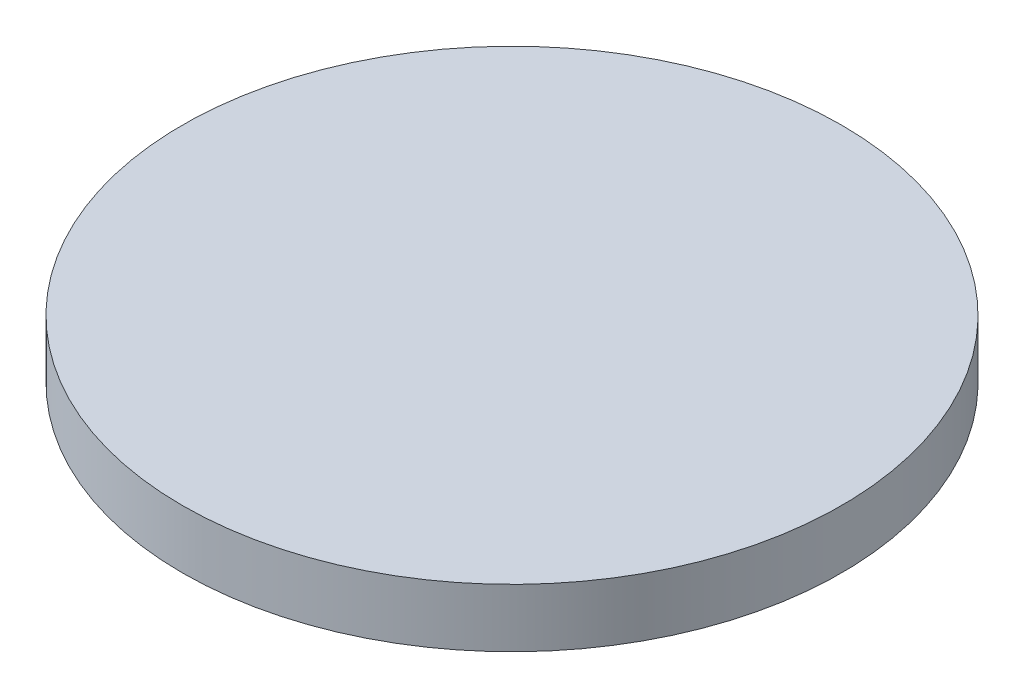
ISO-10303-21;
HEADER;
FILE_DESCRIPTION(('STEP AP214'),'2;1');
FILE_NAME('part.step','',(''),(''),'','','');
FILE_SCHEMA(('AUTOMOTIVE_DESIGN { 1 0 10303 214 1 1 1 1 }'));
ENDSEC;
DATA;
#1=APPLICATION_CONTEXT('core data for automotive mechanical design processes');
#2=APPLICATION_PROTOCOL_DEFINITION('international standard','automotive_design',2000,#1);
#3=PRODUCT_CONTEXT('',#1,'mechanical');
#4=PRODUCT('Part','Part','',(#3));
#5=PRODUCT_RELATED_PRODUCT_CATEGORY('part','',(#4));
#6=PRODUCT_DEFINITION_FORMATION('','',#4);
#7=PRODUCT_DEFINITION_CONTEXT('part definition',#1,'design');
#8=PRODUCT_DEFINITION('design','',#6,#7);
#9=PRODUCT_DEFINITION_SHAPE('','',#8);
#10=(LENGTH_UNIT() NAMED_UNIT(*) SI_UNIT(.MILLI.,.METRE.));
#11=(NAMED_UNIT(*) PLANE_ANGLE_UNIT() SI_UNIT($,.RADIAN.));
#12=(NAMED_UNIT(*) SI_UNIT($,.STERADIAN.) SOLID_ANGLE_UNIT());
#13=UNCERTAINTY_MEASURE_WITH_UNIT(LENGTH_MEASURE(1.E-05),#10,'distance_accuracy_value','');
#14=(GEOMETRIC_REPRESENTATION_CONTEXT(3) GLOBAL_UNCERTAINTY_ASSIGNED_CONTEXT((#13)) GLOBAL_UNIT_ASSIGNED_CONTEXT((#10,
#11,#12)) REPRESENTATION_CONTEXT('',''));
#15=CARTESIAN_POINT('',(0.,0.,0.));
#16=DIRECTION('',(0.,0.,1.));
#17=DIRECTION('',(1.,0.,0.));
#18=AXIS2_PLACEMENT_3D('',#15,#16,#17);
#19=CARTESIAN_POINT('',(0.,2.,0.));
#20=DIRECTION('',(0.,-1.,0.));
#21=DIRECTION('',(0.,0.,-1.));
#22=AXIS2_PLACEMENT_3D('',#19,#20,#21);
#23=CYLINDRICAL_SURFACE('',#22,11.292);
#24=CARTESIAN_POINT('',(0.,2.,0.));
#25=DIRECTION('',(0.,1.,0.));
#26=DIRECTION('',(0.,0.,1.));
#27=AXIS2_PLACEMENT_3D('',#24,#25,#26);
#28=CIRCLE('',#27,11.292);
#29=CARTESIAN_POINT('',(0.,2.,11.292));
#30=VERTEX_POINT('',#29);
#31=EDGE_CURVE('E10',#30,#30,#28,.T.);
#32=ORIENTED_EDGE('',*,*,#31,.F.);
#33=EDGE_LOOP('',(#32));
#34=FACE_BOUND('',#33,.T.);
#35=CARTESIAN_POINT('',(0.,0.,0.));
#36=DIRECTION('',(0.,1.,0.));
#37=DIRECTION('',(0.,0.,1.));
#38=AXIS2_PLACEMENT_3D('',#35,#36,#37);
#39=CIRCLE('',#38,11.292);
#40=CARTESIAN_POINT('',(0.,0.,11.292));
#41=VERTEX_POINT('',#40);
#42=EDGE_CURVE('E34',#41,#41,#39,.T.);
#43=ORIENTED_EDGE('',*,*,#42,.T.);
#44=EDGE_LOOP('',(#43));
#45=FACE_BOUND('',#44,.T.);
#46=ADVANCED_FACE('F31',(#34,#45),#23,.T.);
#47=CARTESIAN_POINT('',(0.,2.,0.));
#48=DIRECTION('',(0.,1.,0.));
#49=DIRECTION('',(0.,0.,1.));
#50=AXIS2_PLACEMENT_3D('',#47,#48,#49);
#51=PLANE('',#50);
#52=ORIENTED_EDGE('',*,*,#31,.T.);
#53=EDGE_LOOP('',(#52));
#54=FACE_BOUND('',#53,.T.);
#55=ADVANCED_FACE('F46',(#54),#51,.T.);
#56=CARTESIAN_POINT('',(0.,0.,0.));
#57=DIRECTION('',(0.,1.,0.));
#58=DIRECTION('',(0.,0.,1.));
#59=AXIS2_PLACEMENT_3D('',#56,#57,#58);
#60=PLANE('',#59);
#61=ORIENTED_EDGE('',*,*,#42,.F.);
#62=EDGE_LOOP('',(#61));
#63=FACE_BOUND('',#62,.T.);
#64=ADVANCED_FACE('F44',(#63),#60,.F.);
#65=CLOSED_SHELL('',(#46,#55,#64));
#66=MANIFOLD_SOLID_BREP('B2',#65);
#67=ADVANCED_BREP_SHAPE_REPRESENTATION('',(#18,#66),#14);
#68=SHAPE_DEFINITION_REPRESENTATION(#9,#67);
ENDSEC;
END-ISO-10303-21;
